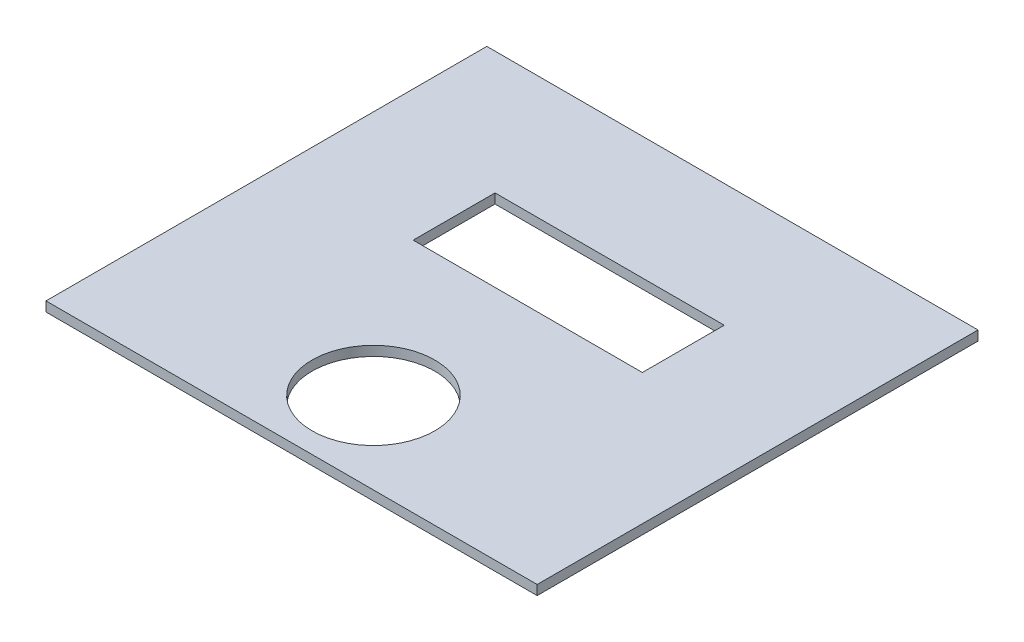
ISO-10303-21;
HEADER;
FILE_DESCRIPTION(('STEP AP214'),'2;1');
FILE_NAME('part.step','',(''),(''),'','','');
FILE_SCHEMA(('AUTOMOTIVE_DESIGN { 1 0 10303 214 1 1 1 1 }'));
ENDSEC;
DATA;
#1=APPLICATION_CONTEXT('core data for automotive mechanical design processes');
#2=APPLICATION_PROTOCOL_DEFINITION('international standard','automotive_design',2000,#1);
#3=PRODUCT_CONTEXT('',#1,'mechanical');
#4=PRODUCT('Part','Part','',(#3));
#5=PRODUCT_RELATED_PRODUCT_CATEGORY('part','',(#4));
#6=PRODUCT_DEFINITION_FORMATION('','',#4);
#7=PRODUCT_DEFINITION_CONTEXT('part definition',#1,'design');
#8=PRODUCT_DEFINITION('design','',#6,#7);
#9=PRODUCT_DEFINITION_SHAPE('','',#8);
#10=(LENGTH_UNIT() NAMED_UNIT(*) SI_UNIT(.MILLI.,.METRE.));
#11=(NAMED_UNIT(*) PLANE_ANGLE_UNIT() SI_UNIT($,.RADIAN.));
#12=(NAMED_UNIT(*) SI_UNIT($,.STERADIAN.) SOLID_ANGLE_UNIT());
#13=UNCERTAINTY_MEASURE_WITH_UNIT(LENGTH_MEASURE(1.E-05),#10,'distance_accuracy_value','');
#14=(GEOMETRIC_REPRESENTATION_CONTEXT(3) GLOBAL_UNCERTAINTY_ASSIGNED_CONTEXT((#13)) GLOBAL_UNIT_ASSIGNED_CONTEXT((#10,
#11,#12)) REPRESENTATION_CONTEXT('',''));
#15=CARTESIAN_POINT('',(0.,0.,0.));
#16=DIRECTION('',(0.,0.,1.));
#17=DIRECTION('',(1.,0.,0.));
#18=AXIS2_PLACEMENT_3D('',#15,#16,#17);
#19=CARTESIAN_POINT('',(0.,3.,0.));
#20=DIRECTION('',(0.,1.,0.));
#21=DIRECTION('',(0.,0.,1.));
#22=AXIS2_PLACEMENT_3D('',#19,#20,#21);
#23=PLANE('',#22);
#24=DIRECTION('',(-1.,0.,0.));
#25=VECTOR('',#24,1.);
#26=CARTESIAN_POINT('',(-35.56,3.,-30.29204));
#27=LINE('',#26,#25);
#28=CARTESIAN_POINT('',(35.56,3.,-30.29204));
#29=VERTEX_POINT('',#28);
#30=CARTESIAN_POINT('',(-35.56,3.,-30.29204));
#31=VERTEX_POINT('',#30);
#32=EDGE_CURVE('E112',#29,#31,#27,.T.);
#33=ORIENTED_EDGE('',*,*,#32,.F.);
#34=DIRECTION('',(0.,0.,-1.));
#35=VECTOR('',#34,1.);
#36=CARTESIAN_POINT('',(35.56,3.,-4.89204000000002));
#37=LINE('',#36,#35);
#38=CARTESIAN_POINT('',(35.56,3.,-4.89204000000002));
#39=VERTEX_POINT('',#38);
#40=EDGE_CURVE('E104',#39,#29,#37,.T.);
#41=ORIENTED_EDGE('',*,*,#40,.F.);
#42=DIRECTION('',(1.,0.,0.));
#43=VECTOR('',#42,1.);
#44=CARTESIAN_POINT('',(-35.56,3.,-4.89204000000002));
#45=LINE('',#44,#43);
#46=CARTESIAN_POINT('',(-35.56,3.,-4.89204000000002));
#47=VERTEX_POINT('',#46);
#48=EDGE_CURVE('E127',#47,#39,#45,.T.);
#49=ORIENTED_EDGE('',*,*,#48,.F.);
#50=DIRECTION('',(0.,0.,1.));
#51=VECTOR('',#50,1.);
#52=CARTESIAN_POINT('',(-35.56,3.,-4.89204000000002));
#53=LINE('',#52,#51);
#54=EDGE_CURVE('E125',#31,#47,#53,.T.);
#55=ORIENTED_EDGE('',*,*,#54,.F.);
#56=EDGE_LOOP('',(#33,#41,#49,#55));
#57=FACE_BOUND('',#56,.T.);
#58=DIRECTION('',(0.,0.,-1.));
#59=VECTOR('',#58,1.);
#60=CARTESIAN_POINT('',(76.2,3.,-68.39204));
#61=LINE('',#60,#59);
#62=CARTESIAN_POINT('',(76.2,3.,68.39204));
#63=VERTEX_POINT('',#62);
#64=CARTESIAN_POINT('',(76.2,3.,-68.39204));
#65=VERTEX_POINT('',#64);
#66=EDGE_CURVE('E143',#63,#65,#61,.T.);
#67=ORIENTED_EDGE('',*,*,#66,.T.);
#68=DIRECTION('',(-1.,0.,0.));
#69=VECTOR('',#68,1.);
#70=CARTESIAN_POINT('',(-76.2,3.,-68.39204));
#71=LINE('',#70,#69);
#72=CARTESIAN_POINT('',(-76.2,3.,-68.39204));
#73=VERTEX_POINT('',#72);
#74=EDGE_CURVE('E146',#65,#73,#71,.T.);
#75=ORIENTED_EDGE('',*,*,#74,.T.);
#76=DIRECTION('',(0.,0.,1.));
#77=VECTOR('',#76,1.);
#78=CARTESIAN_POINT('',(-76.2,3.,-68.39204));
#79=LINE('',#78,#77);
#80=CARTESIAN_POINT('',(-76.2,3.,68.39204));
#81=VERTEX_POINT('',#80);
#82=EDGE_CURVE('E149',#73,#81,#79,.T.);
#83=ORIENTED_EDGE('',*,*,#82,.T.);
#84=DIRECTION('',(1.,0.,0.));
#85=VECTOR('',#84,1.);
#86=CARTESIAN_POINT('',(-76.2,3.,68.39204));
#87=LINE('',#86,#85);
#88=EDGE_CURVE('E151',#81,#63,#87,.T.);
#89=ORIENTED_EDGE('',*,*,#88,.T.);
#90=EDGE_LOOP('',(#67,#75,#83,#89));
#91=FACE_BOUND('',#90,.T.);
#92=CARTESIAN_POINT('',(0.,3.,42.99204));
#93=DIRECTION('',(0.,1.,0.));
#94=DIRECTION('',(0.,0.,1.));
#95=AXIS2_PLACEMENT_3D('',#92,#93,#94);
#96=CIRCLE('',#95,19.05);
#97=CARTESIAN_POINT('',(0.,3.,62.04204));
#98=VERTEX_POINT('',#97);
#99=EDGE_CURVE('E133',#98,#98,#96,.T.);
#100=ORIENTED_EDGE('',*,*,#99,.F.);
#101=EDGE_LOOP('',(#100));
#102=FACE_BOUND('',#101,.T.);
#103=ADVANCED_FACE('F39',(#57,#91,#102),#23,.T.);
#104=CARTESIAN_POINT('',(0.,0.,0.));
#105=DIRECTION('',(0.,1.,0.));
#106=DIRECTION('',(0.,0.,1.));
#107=AXIS2_PLACEMENT_3D('',#104,#105,#106);
#108=PLANE('',#107);
#109=DIRECTION('',(0.,0.,-1.));
#110=VECTOR('',#109,1.);
#111=CARTESIAN_POINT('',(76.2,0.,-68.39204));
#112=LINE('',#111,#110);
#113=CARTESIAN_POINT('',(76.2,0.,68.39204));
#114=VERTEX_POINT('',#113);
#115=CARTESIAN_POINT('',(76.2,0.,-68.39204));
#116=VERTEX_POINT('',#115);
#117=EDGE_CURVE('E120',#114,#116,#112,.T.);
#118=ORIENTED_EDGE('',*,*,#117,.F.);
#119=DIRECTION('',(1.,0.,0.));
#120=VECTOR('',#119,1.);
#121=CARTESIAN_POINT('',(-76.2,0.,68.39204));
#122=LINE('',#121,#120);
#123=CARTESIAN_POINT('',(-76.2,0.,68.39204));
#124=VERTEX_POINT('',#123);
#125=EDGE_CURVE('E147',#124,#114,#122,.T.);
#126=ORIENTED_EDGE('',*,*,#125,.F.);
#127=DIRECTION('',(0.,0.,1.));
#128=VECTOR('',#127,1.);
#129=CARTESIAN_POINT('',(-76.2,0.,-68.39204));
#130=LINE('',#129,#128);
#131=CARTESIAN_POINT('',(-76.2,0.,-68.39204));
#132=VERTEX_POINT('',#131);
#133=EDGE_CURVE('E158',#132,#124,#130,.T.);
#134=ORIENTED_EDGE('',*,*,#133,.F.);
#135=DIRECTION('',(-1.,0.,0.));
#136=VECTOR('',#135,1.);
#137=CARTESIAN_POINT('',(-76.2,0.,-68.39204));
#138=LINE('',#137,#136);
#139=EDGE_CURVE('E156',#116,#132,#138,.T.);
#140=ORIENTED_EDGE('',*,*,#139,.F.);
#141=EDGE_LOOP('',(#118,#126,#134,#140));
#142=FACE_BOUND('',#141,.T.);
#143=DIRECTION('',(0.,0.,-1.));
#144=VECTOR('',#143,1.);
#145=CARTESIAN_POINT('',(35.56,0.,-4.89204000000002));
#146=LINE('',#145,#144);
#147=CARTESIAN_POINT('',(35.56,0.,-4.89204000000002));
#148=VERTEX_POINT('',#147);
#149=CARTESIAN_POINT('',(35.56,0.,-30.29204));
#150=VERTEX_POINT('',#149);
#151=EDGE_CURVE('E62',#148,#150,#146,.T.);
#152=ORIENTED_EDGE('',*,*,#151,.T.);
#153=DIRECTION('',(-1.,0.,0.));
#154=VECTOR('',#153,1.);
#155=CARTESIAN_POINT('',(-35.56,0.,-30.29204));
#156=LINE('',#155,#154);
#157=CARTESIAN_POINT('',(-35.56,0.,-30.29204));
#158=VERTEX_POINT('',#157);
#159=EDGE_CURVE('E119',#150,#158,#156,.T.);
#160=ORIENTED_EDGE('',*,*,#159,.T.);
#161=DIRECTION('',(0.,0.,1.));
#162=VECTOR('',#161,1.);
#163=CARTESIAN_POINT('',(-35.56,0.,-4.89204000000002));
#164=LINE('',#163,#162);
#165=CARTESIAN_POINT('',(-35.56,0.,-4.89204000000002));
#166=VERTEX_POINT('',#165);
#167=EDGE_CURVE('E135',#158,#166,#164,.T.);
#168=ORIENTED_EDGE('',*,*,#167,.T.);
#169=DIRECTION('',(1.,0.,0.));
#170=VECTOR('',#169,1.);
#171=CARTESIAN_POINT('',(-35.56,0.,-4.89204000000002));
#172=LINE('',#171,#170);
#173=EDGE_CURVE('E113',#166,#148,#172,.T.);
#174=ORIENTED_EDGE('',*,*,#173,.T.);
#175=EDGE_LOOP('',(#152,#160,#168,#174));
#176=FACE_BOUND('',#175,.T.);
#177=CARTESIAN_POINT('',(0.,0.,42.99204));
#178=DIRECTION('',(0.,1.,0.));
#179=DIRECTION('',(0.,0.,1.));
#180=AXIS2_PLACEMENT_3D('',#177,#178,#179);
#181=CIRCLE('',#180,19.05);
#182=CARTESIAN_POINT('',(0.,0.,62.04204));
#183=VERTEX_POINT('',#182);
#184=EDGE_CURVE('E229',#183,#183,#181,.T.);
#185=ORIENTED_EDGE('',*,*,#184,.T.);
#186=EDGE_LOOP('',(#185));
#187=FACE_BOUND('',#186,.T.);
#188=ADVANCED_FACE('F176',(#142,#176,#187),#108,.F.);
#189=CARTESIAN_POINT('',(76.2,3.,-68.39204));
#190=DIRECTION('',(-1.,0.,0.));
#191=DIRECTION('',(0.,0.,1.));
#192=AXIS2_PLACEMENT_3D('',#189,#190,#191);
#193=PLANE('',#192);
#194=ORIENTED_EDGE('',*,*,#117,.T.);
#195=DIRECTION('',(0.,-1.,0.));
#196=VECTOR('',#195,1.);
#197=CARTESIAN_POINT('',(76.2,3.,-68.39204));
#198=LINE('',#197,#196);
#199=EDGE_CURVE('E11',#65,#116,#198,.T.);
#200=ORIENTED_EDGE('',*,*,#199,.F.);
#201=ORIENTED_EDGE('',*,*,#66,.F.);
#202=DIRECTION('',(0.,-1.,0.));
#203=VECTOR('',#202,1.);
#204=CARTESIAN_POINT('',(76.2,3.,68.39204));
#205=LINE('',#204,#203);
#206=EDGE_CURVE('E153',#63,#114,#205,.T.);
#207=ORIENTED_EDGE('',*,*,#206,.T.);
#208=EDGE_LOOP('',(#194,#200,#201,#207));
#209=FACE_BOUND('',#208,.T.);
#210=ADVANCED_FACE('F41',(#209),#193,.F.);
#211=CARTESIAN_POINT('',(-76.2,3.,-68.39204));
#212=DIRECTION('',(0.,0.,1.));
#213=DIRECTION('',(1.,0.,0.));
#214=AXIS2_PLACEMENT_3D('',#211,#212,#213);
#215=PLANE('',#214);
#216=ORIENTED_EDGE('',*,*,#139,.T.);
#217=DIRECTION('',(0.,-1.,0.));
#218=VECTOR('',#217,1.);
#219=CARTESIAN_POINT('',(-76.2,3.,-68.39204));
#220=LINE('',#219,#218);
#221=EDGE_CURVE('E47',#73,#132,#220,.T.);
#222=ORIENTED_EDGE('',*,*,#221,.F.);
#223=ORIENTED_EDGE('',*,*,#74,.F.);
#224=ORIENTED_EDGE('',*,*,#199,.T.);
#225=EDGE_LOOP('',(#216,#222,#223,#224));
#226=FACE_BOUND('',#225,.T.);
#227=ADVANCED_FACE('F186',(#226),#215,.F.);
#228=CARTESIAN_POINT('',(-76.2,3.,-68.39204));
#229=DIRECTION('',(1.,0.,0.));
#230=DIRECTION('',(0.,0.,-1.));
#231=AXIS2_PLACEMENT_3D('',#228,#229,#230);
#232=PLANE('',#231);
#233=ORIENTED_EDGE('',*,*,#133,.T.);
#234=DIRECTION('',(0.,-1.,0.));
#235=VECTOR('',#234,1.);
#236=CARTESIAN_POINT('',(-76.2,3.,68.39204));
#237=LINE('',#236,#235);
#238=EDGE_CURVE('E163',#81,#124,#237,.T.);
#239=ORIENTED_EDGE('',*,*,#238,.F.);
#240=ORIENTED_EDGE('',*,*,#82,.F.);
#241=ORIENTED_EDGE('',*,*,#221,.T.);
#242=EDGE_LOOP('',(#233,#239,#240,#241));
#243=FACE_BOUND('',#242,.T.);
#244=ADVANCED_FACE('F170',(#243),#232,.F.);
#245=CARTESIAN_POINT('',(-76.2,3.,68.39204));
#246=DIRECTION('',(0.,0.,-1.));
#247=DIRECTION('',(-1.,0.,0.));
#248=AXIS2_PLACEMENT_3D('',#245,#246,#247);
#249=PLANE('',#248);
#250=ORIENTED_EDGE('',*,*,#125,.T.);
#251=ORIENTED_EDGE('',*,*,#206,.F.);
#252=ORIENTED_EDGE('',*,*,#88,.F.);
#253=ORIENTED_EDGE('',*,*,#238,.T.);
#254=EDGE_LOOP('',(#250,#251,#252,#253));
#255=FACE_BOUND('',#254,.T.);
#256=ADVANCED_FACE('F180',(#255),#249,.F.);
#257=CARTESIAN_POINT('',(35.56,3.,-4.89204000000002));
#258=DIRECTION('',(-1.,0.,0.));
#259=DIRECTION('',(0.,0.,1.));
#260=AXIS2_PLACEMENT_3D('',#257,#258,#259);
#261=PLANE('',#260);
#262=ORIENTED_EDGE('',*,*,#151,.F.);
#263=DIRECTION('',(0.,-1.,0.));
#264=VECTOR('',#263,1.);
#265=CARTESIAN_POINT('',(35.56,3.,-4.89204000000002));
#266=LINE('',#265,#264);
#267=EDGE_CURVE('E108',#39,#148,#266,.T.);
#268=ORIENTED_EDGE('',*,*,#267,.F.);
#269=ORIENTED_EDGE('',*,*,#40,.T.);
#270=DIRECTION('',(0.,-1.,0.));
#271=VECTOR('',#270,1.);
#272=CARTESIAN_POINT('',(35.56,3.,-30.29204));
#273=LINE('',#272,#271);
#274=EDGE_CURVE('E107',#29,#150,#273,.T.);
#275=ORIENTED_EDGE('',*,*,#274,.T.);
#276=EDGE_LOOP('',(#262,#268,#269,#275));
#277=FACE_BOUND('',#276,.T.);
#278=ADVANCED_FACE('F106',(#277),#261,.T.);
#279=CARTESIAN_POINT('',(-35.56,3.,-30.29204));
#280=DIRECTION('',(0.,0.,1.));
#281=DIRECTION('',(1.,0.,0.));
#282=AXIS2_PLACEMENT_3D('',#279,#280,#281);
#283=PLANE('',#282);
#284=ORIENTED_EDGE('',*,*,#159,.F.);
#285=ORIENTED_EDGE('',*,*,#274,.F.);
#286=ORIENTED_EDGE('',*,*,#32,.T.);
#287=DIRECTION('',(0.,-1.,0.));
#288=VECTOR('',#287,1.);
#289=CARTESIAN_POINT('',(-35.56,3.,-30.29204));
#290=LINE('',#289,#288);
#291=EDGE_CURVE('E121',#31,#158,#290,.T.);
#292=ORIENTED_EDGE('',*,*,#291,.T.);
#293=EDGE_LOOP('',(#284,#285,#286,#292));
#294=FACE_BOUND('',#293,.T.);
#295=ADVANCED_FACE('F116',(#294),#283,.T.);
#296=CARTESIAN_POINT('',(-35.56,3.,-4.89204000000002));
#297=DIRECTION('',(1.,0.,0.));
#298=DIRECTION('',(0.,0.,-1.));
#299=AXIS2_PLACEMENT_3D('',#296,#297,#298);
#300=PLANE('',#299);
#301=ORIENTED_EDGE('',*,*,#167,.F.);
#302=ORIENTED_EDGE('',*,*,#291,.F.);
#303=ORIENTED_EDGE('',*,*,#54,.T.);
#304=DIRECTION('',(0.,-1.,0.));
#305=VECTOR('',#304,1.);
#306=CARTESIAN_POINT('',(-35.56,3.,-4.89204000000002));
#307=LINE('',#306,#305);
#308=EDGE_CURVE('E54',#47,#166,#307,.T.);
#309=ORIENTED_EDGE('',*,*,#308,.T.);
#310=EDGE_LOOP('',(#301,#302,#303,#309));
#311=FACE_BOUND('',#310,.T.);
#312=ADVANCED_FACE('F209',(#311),#300,.T.);
#313=CARTESIAN_POINT('',(-35.56,3.,-4.89204000000002));
#314=DIRECTION('',(0.,0.,-1.));
#315=DIRECTION('',(-1.,0.,0.));
#316=AXIS2_PLACEMENT_3D('',#313,#314,#315);
#317=PLANE('',#316);
#318=ORIENTED_EDGE('',*,*,#173,.F.);
#319=ORIENTED_EDGE('',*,*,#308,.F.);
#320=ORIENTED_EDGE('',*,*,#48,.T.);
#321=ORIENTED_EDGE('',*,*,#267,.T.);
#322=EDGE_LOOP('',(#318,#319,#320,#321));
#323=FACE_BOUND('',#322,.T.);
#324=ADVANCED_FACE('F213',(#323),#317,.T.);
#325=CARTESIAN_POINT('',(0.,3.,42.99204));
#326=DIRECTION('',(0.,-1.,0.));
#327=DIRECTION('',(0.,0.,-1.));
#328=AXIS2_PLACEMENT_3D('',#325,#326,#327);
#329=CYLINDRICAL_SURFACE('',#328,19.05);
#330=ORIENTED_EDGE('',*,*,#99,.T.);
#331=EDGE_LOOP('',(#330));
#332=FACE_BOUND('',#331,.T.);
#333=ORIENTED_EDGE('',*,*,#184,.F.);
#334=EDGE_LOOP('',(#333));
#335=FACE_BOUND('',#334,.T.);
#336=ADVANCED_FACE('F219',(#332,#335),#329,.F.);
#337=CLOSED_SHELL('',(#103,#188,#210,#227,#244,#256,#278,#295,#312,#324,#336));
#338=MANIFOLD_SOLID_BREP('B2',#337);
#339=ADVANCED_BREP_SHAPE_REPRESENTATION('',(#18,#338),#14);
#340=SHAPE_DEFINITION_REPRESENTATION(#9,#339);
ENDSEC;
END-ISO-10303-21;
